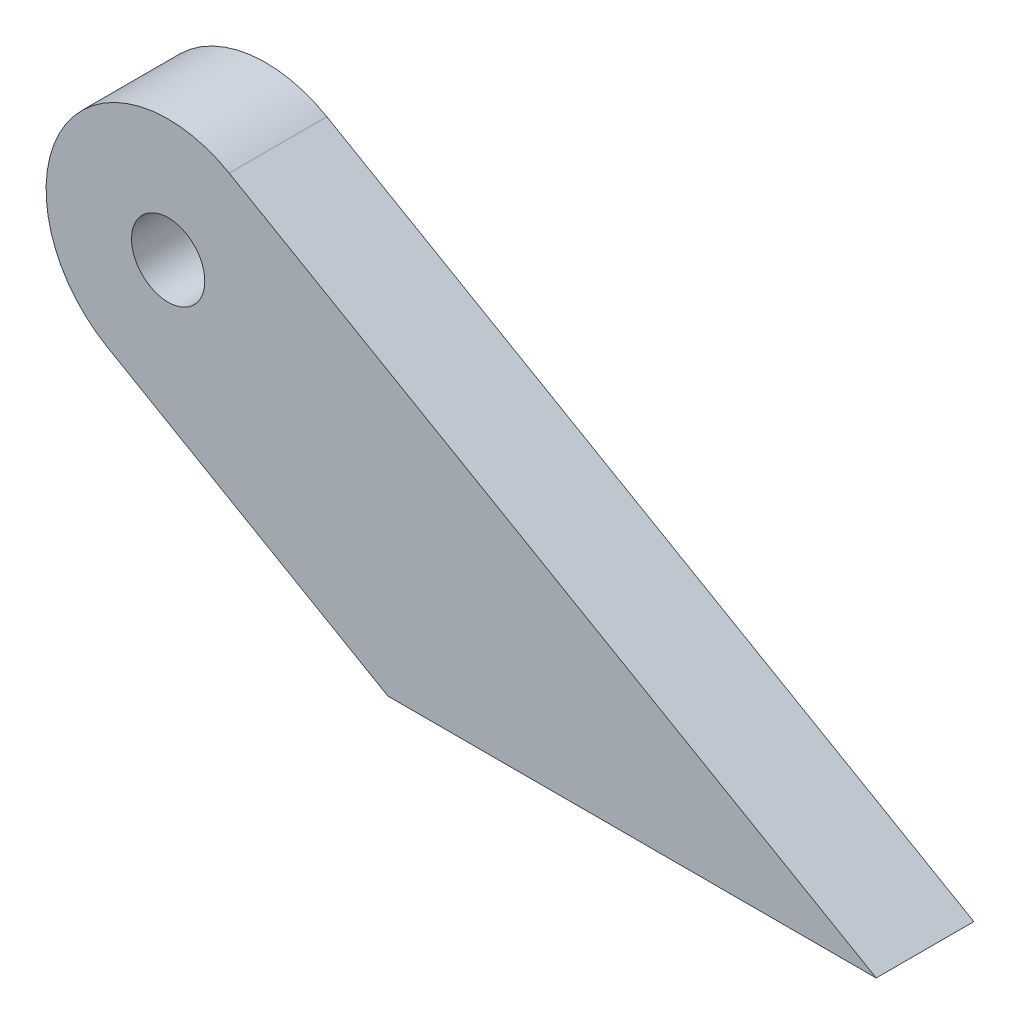
ISO-10303-21;
HEADER;
FILE_DESCRIPTION(('STEP AP214'),'2;1');
FILE_NAME('part.step','',(''),(''),'','','');
FILE_SCHEMA(('AUTOMOTIVE_DESIGN { 1 0 10303 214 1 1 1 1 }'));
ENDSEC;
DATA;
#1=APPLICATION_CONTEXT('core data for automotive mechanical design processes');
#2=APPLICATION_PROTOCOL_DEFINITION('international standard','automotive_design',2000,#1);
#3=PRODUCT_CONTEXT('',#1,'mechanical');
#4=PRODUCT('Part','Part','',(#3));
#5=PRODUCT_RELATED_PRODUCT_CATEGORY('part','',(#4));
#6=PRODUCT_DEFINITION_FORMATION('','',#4);
#7=PRODUCT_DEFINITION_CONTEXT('part definition',#1,'design');
#8=PRODUCT_DEFINITION('design','',#6,#7);
#9=PRODUCT_DEFINITION_SHAPE('','',#8);
#10=(LENGTH_UNIT() NAMED_UNIT(*) SI_UNIT(.MILLI.,.METRE.));
#11=(NAMED_UNIT(*) PLANE_ANGLE_UNIT() SI_UNIT($,.RADIAN.));
#12=(NAMED_UNIT(*) SI_UNIT($,.STERADIAN.) SOLID_ANGLE_UNIT());
#13=UNCERTAINTY_MEASURE_WITH_UNIT(LENGTH_MEASURE(1.E-05),#10,'distance_accuracy_value','');
#14=(GEOMETRIC_REPRESENTATION_CONTEXT(3) GLOBAL_UNCERTAINTY_ASSIGNED_CONTEXT((#13)) GLOBAL_UNIT_ASSIGNED_CONTEXT((#10,
#11,#12)) REPRESENTATION_CONTEXT('',''));
#15=CARTESIAN_POINT('',(0.,0.,0.));
#16=DIRECTION('',(0.,0.,1.));
#17=DIRECTION('',(1.,0.,0.));
#18=AXIS2_PLACEMENT_3D('',#15,#16,#17);
#19=CARTESIAN_POINT('',(-4.5,5.48482755730144,2.));
#20=DIRECTION('',(0.,0.,1.));
#21=DIRECTION('',(1.,0.,0.));
#22=AXIS2_PLACEMENT_3D('',#19,#20,#21);
#23=PLANE('',#22);
#24=DIRECTION('',(0.866025403784439,-0.5,0.));
#25=VECTOR('',#24,1.);
#26=CARTESIAN_POINT('',(-5.75,3.31976404784035,2.));
#27=LINE('',#26,#25);
#28=CARTESIAN_POINT('',(-5.75,3.31976404784035,2.));
#29=VERTEX_POINT('',#28);
#30=CARTESIAN_POINT('',(0.,0.,2.));
#31=VERTEX_POINT('',#30);
#32=EDGE_CURVE('E85',#29,#31,#27,.T.);
#33=ORIENTED_EDGE('',*,*,#32,.T.);
#34=DIRECTION('',(1.,0.,0.));
#35=VECTOR('',#34,1.);
#36=CARTESIAN_POINT('',(0.,0.,2.));
#37=LINE('',#36,#35);
#38=CARTESIAN_POINT('',(10.,0.,2.));
#39=VERTEX_POINT('',#38);
#40=EDGE_CURVE('E80',#31,#39,#37,.T.);
#41=ORIENTED_EDGE('',*,*,#40,.T.);
#42=DIRECTION('',(-0.866025403784439,0.5,0.));
#43=VECTOR('',#42,1.);
#44=CARTESIAN_POINT('',(10.,0.,2.));
#45=LINE('',#44,#43);
#46=CARTESIAN_POINT('',(-3.25,7.64989106676254,2.));
#47=VERTEX_POINT('',#46);
#48=EDGE_CURVE('E83',#39,#47,#45,.T.);
#49=ORIENTED_EDGE('',*,*,#48,.T.);
#50=CARTESIAN_POINT('',(-4.5,5.48482755730144,2.));
#51=DIRECTION('',(0.,0.,1.));
#52=DIRECTION('',(1.,0.,0.));
#53=AXIS2_PLACEMENT_3D('',#50,#51,#52);
#54=CIRCLE('',#53,2.5);
#55=EDGE_CURVE('E50',#47,#29,#54,.T.);
#56=ORIENTED_EDGE('',*,*,#55,.T.);
#57=EDGE_LOOP('',(#33,#41,#49,#56));
#58=FACE_BOUND('',#57,.T.);
#59=CARTESIAN_POINT('',(-4.5,5.48482755730144,2.));
#60=DIRECTION('',(0.,0.,1.));
#61=DIRECTION('',(1.,0.,0.));
#62=AXIS2_PLACEMENT_3D('',#59,#60,#61);
#63=CIRCLE('',#62,0.750000000000001);
#64=CARTESIAN_POINT('',(-3.75,5.48482755730144,2.));
#65=VERTEX_POINT('',#64);
#66=EDGE_CURVE('E100',#65,#65,#63,.T.);
#67=ORIENTED_EDGE('',*,*,#66,.F.);
#68=EDGE_LOOP('',(#67));
#69=FACE_BOUND('',#68,.T.);
#70=ADVANCED_FACE('F33',(#58,#69),#23,.T.);
#71=CARTESIAN_POINT('',(-4.5,5.48482755730144,0.));
#72=DIRECTION('',(0.,0.,1.));
#73=DIRECTION('',(1.,0.,0.));
#74=AXIS2_PLACEMENT_3D('',#71,#72,#73);
#75=PLANE('',#74);
#76=DIRECTION('',(0.866025403784439,-0.5,0.));
#77=VECTOR('',#76,1.);
#78=CARTESIAN_POINT('',(-5.75,3.31976404784035,0.));
#79=LINE('',#78,#77);
#80=CARTESIAN_POINT('',(-5.75,3.31976404784035,0.));
#81=VERTEX_POINT('',#80);
#82=CARTESIAN_POINT('',(0.,0.,0.));
#83=VERTEX_POINT('',#82);
#84=EDGE_CURVE('E97',#81,#83,#79,.T.);
#85=ORIENTED_EDGE('',*,*,#84,.F.);
#86=CARTESIAN_POINT('',(-4.5,5.48482755730144,0.));
#87=DIRECTION('',(0.,0.,1.));
#88=DIRECTION('',(1.,0.,0.));
#89=AXIS2_PLACEMENT_3D('',#86,#87,#88);
#90=CIRCLE('',#89,2.5);
#91=CARTESIAN_POINT('',(-3.25,7.64989106676254,0.));
#92=VERTEX_POINT('',#91);
#93=EDGE_CURVE('E73',#92,#81,#90,.T.);
#94=ORIENTED_EDGE('',*,*,#93,.F.);
#95=DIRECTION('',(-0.866025403784439,0.5,0.));
#96=VECTOR('',#95,1.);
#97=CARTESIAN_POINT('',(10.,0.,0.));
#98=LINE('',#97,#96);
#99=CARTESIAN_POINT('',(10.,0.,0.));
#100=VERTEX_POINT('',#99);
#101=EDGE_CURVE('E67',#100,#92,#98,.T.);
#102=ORIENTED_EDGE('',*,*,#101,.F.);
#103=DIRECTION('',(1.,0.,0.));
#104=VECTOR('',#103,1.);
#105=CARTESIAN_POINT('',(0.,0.,0.));
#106=LINE('',#105,#104);
#107=EDGE_CURVE('E89',#83,#100,#106,.T.);
#108=ORIENTED_EDGE('',*,*,#107,.F.);
#109=EDGE_LOOP('',(#85,#94,#102,#108));
#110=FACE_BOUND('',#109,.T.);
#111=CARTESIAN_POINT('',(-4.5,5.48482755730144,0.));
#112=DIRECTION('',(0.,0.,1.));
#113=DIRECTION('',(1.,0.,0.));
#114=AXIS2_PLACEMENT_3D('',#111,#112,#113);
#115=CIRCLE('',#114,0.750000000000001);
#116=CARTESIAN_POINT('',(-3.75,5.48482755730144,0.));
#117=VERTEX_POINT('',#116);
#118=EDGE_CURVE('E112',#117,#117,#115,.T.);
#119=ORIENTED_EDGE('',*,*,#118,.T.);
#120=EDGE_LOOP('',(#119));
#121=FACE_BOUND('',#120,.T.);
#122=ADVANCED_FACE('F108',(#110,#121),#75,.F.);
#123=CARTESIAN_POINT('',(-5.75,3.31976404784035,2.));
#124=DIRECTION('',(0.5,0.866025403784439,0.));
#125=DIRECTION('',(-0.866025403784439,0.5,0.));
#126=AXIS2_PLACEMENT_3D('',#123,#124,#125);
#127=PLANE('',#126);
#128=ORIENTED_EDGE('',*,*,#84,.T.);
#129=DIRECTION('',(0.,0.,-1.));
#130=VECTOR('',#129,1.);
#131=CARTESIAN_POINT('',(0.,0.,2.));
#132=LINE('',#131,#130);
#133=EDGE_CURVE('E11',#31,#83,#132,.T.);
#134=ORIENTED_EDGE('',*,*,#133,.F.);
#135=ORIENTED_EDGE('',*,*,#32,.F.);
#136=DIRECTION('',(0.,0.,-1.));
#137=VECTOR('',#136,1.);
#138=CARTESIAN_POINT('',(-5.75,3.31976404784035,2.));
#139=LINE('',#138,#137);
#140=EDGE_CURVE('E93',#29,#81,#139,.T.);
#141=ORIENTED_EDGE('',*,*,#140,.T.);
#142=EDGE_LOOP('',(#128,#134,#135,#141));
#143=FACE_BOUND('',#142,.T.);
#144=ADVANCED_FACE('F35',(#143),#127,.F.);
#145=CARTESIAN_POINT('',(0.,0.,2.));
#146=DIRECTION('',(0.,1.,0.));
#147=DIRECTION('',(0.,0.,1.));
#148=AXIS2_PLACEMENT_3D('',#145,#146,#147);
#149=PLANE('',#148);
#150=ORIENTED_EDGE('',*,*,#107,.T.);
#151=DIRECTION('',(0.,0.,-1.));
#152=VECTOR('',#151,1.);
#153=CARTESIAN_POINT('',(10.,0.,2.));
#154=LINE('',#153,#152);
#155=EDGE_CURVE('E42',#39,#100,#154,.T.);
#156=ORIENTED_EDGE('',*,*,#155,.F.);
#157=ORIENTED_EDGE('',*,*,#40,.F.);
#158=ORIENTED_EDGE('',*,*,#133,.T.);
#159=EDGE_LOOP('',(#150,#156,#157,#158));
#160=FACE_BOUND('',#159,.T.);
#161=ADVANCED_FACE('F88',(#160),#149,.F.);
#162=CARTESIAN_POINT('',(10.,0.,2.));
#163=DIRECTION('',(-0.5,-0.866025403784439,0.));
#164=DIRECTION('',(0.866025403784439,-0.5,0.));
#165=AXIS2_PLACEMENT_3D('',#162,#163,#164);
#166=PLANE('',#165);
#167=ORIENTED_EDGE('',*,*,#101,.T.);
#168=DIRECTION('',(0.,0.,-1.));
#169=VECTOR('',#168,1.);
#170=CARTESIAN_POINT('',(-3.25,7.64989106676254,2.));
#171=LINE('',#170,#169);
#172=EDGE_CURVE('E90',#47,#92,#171,.T.);
#173=ORIENTED_EDGE('',*,*,#172,.F.);
#174=ORIENTED_EDGE('',*,*,#48,.F.);
#175=ORIENTED_EDGE('',*,*,#155,.T.);
#176=EDGE_LOOP('',(#167,#173,#174,#175));
#177=FACE_BOUND('',#176,.T.);
#178=ADVANCED_FACE('F91',(#177),#166,.F.);
#179=CARTESIAN_POINT('',(-4.5,5.48482755730144,2.));
#180=DIRECTION('',(0.,0.,-1.));
#181=DIRECTION('',(-1.,0.,0.));
#182=AXIS2_PLACEMENT_3D('',#179,#180,#181);
#183=CYLINDRICAL_SURFACE('',#182,2.5);
#184=ORIENTED_EDGE('',*,*,#93,.T.);
#185=ORIENTED_EDGE('',*,*,#140,.F.);
#186=ORIENTED_EDGE('',*,*,#55,.F.);
#187=ORIENTED_EDGE('',*,*,#172,.T.);
#188=EDGE_LOOP('',(#184,#185,#186,#187));
#189=FACE_BOUND('',#188,.T.);
#190=ADVANCED_FACE('F105',(#189),#183,.T.);
#191=CARTESIAN_POINT('',(-4.5,5.48482755730144,2.));
#192=DIRECTION('',(0.,0.,-1.));
#193=DIRECTION('',(-1.,0.,0.));
#194=AXIS2_PLACEMENT_3D('',#191,#192,#193);
#195=CYLINDRICAL_SURFACE('',#194,0.750000000000001);
#196=ORIENTED_EDGE('',*,*,#66,.T.);
#197=EDGE_LOOP('',(#196));
#198=FACE_BOUND('',#197,.T.);
#199=ORIENTED_EDGE('',*,*,#118,.F.);
#200=EDGE_LOOP('',(#199));
#201=FACE_BOUND('',#200,.T.);
#202=ADVANCED_FACE('F118',(#198,#201),#195,.F.);
#203=CLOSED_SHELL('',(#70,#122,#144,#161,#178,#190,#202));
#204=MANIFOLD_SOLID_BREP('B2',#203);
#205=ADVANCED_BREP_SHAPE_REPRESENTATION('',(#18,#204),#14);
#206=SHAPE_DEFINITION_REPRESENTATION(#9,#205);
ENDSEC;
END-ISO-10303-21;
